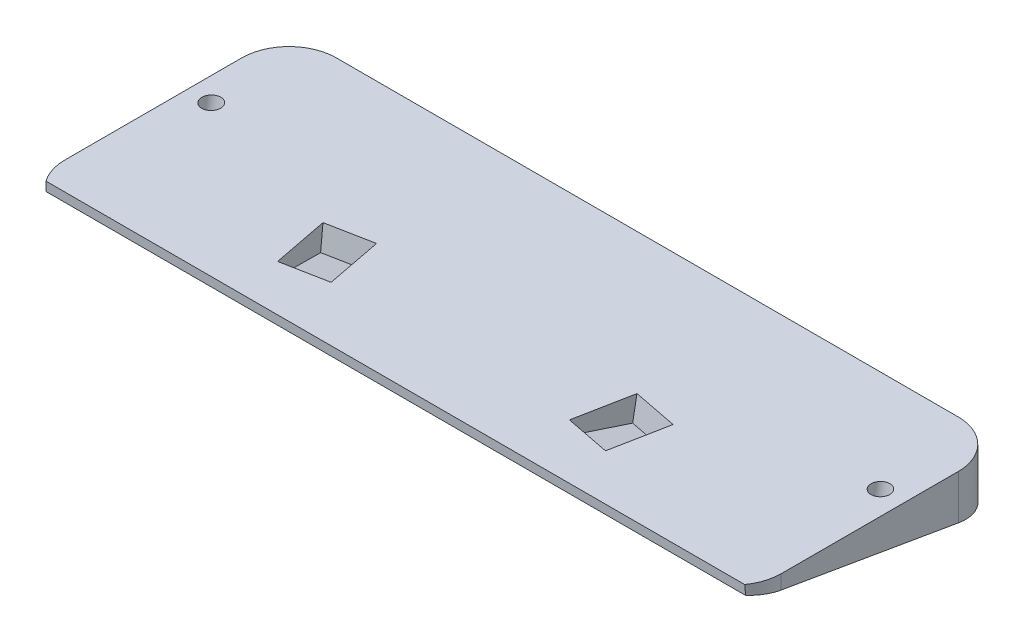
ISO-10303-21;
HEADER;
FILE_DESCRIPTION(('STEP AP214'),'2;1');
FILE_NAME('part.step','',(''),(''),'','','');
FILE_SCHEMA(('AUTOMOTIVE_DESIGN { 1 0 10303 214 1 1 1 1 }'));
ENDSEC;
DATA;
#1=APPLICATION_CONTEXT('core data for automotive mechanical design processes');
#2=APPLICATION_PROTOCOL_DEFINITION('international standard','automotive_design',2000,#1);
#3=PRODUCT_CONTEXT('',#1,'mechanical');
#4=PRODUCT('Part','Part','',(#3));
#5=PRODUCT_RELATED_PRODUCT_CATEGORY('part','',(#4));
#6=PRODUCT_DEFINITION_FORMATION('','',#4);
#7=PRODUCT_DEFINITION_CONTEXT('part definition',#1,'design');
#8=PRODUCT_DEFINITION('design','',#6,#7);
#9=PRODUCT_DEFINITION_SHAPE('','',#8);
#10=(LENGTH_UNIT() NAMED_UNIT(*) SI_UNIT(.MILLI.,.METRE.));
#11=(NAMED_UNIT(*) PLANE_ANGLE_UNIT() SI_UNIT($,.RADIAN.));
#12=(NAMED_UNIT(*) SI_UNIT($,.STERADIAN.) SOLID_ANGLE_UNIT());
#13=UNCERTAINTY_MEASURE_WITH_UNIT(LENGTH_MEASURE(1.E-05),#10,'distance_accuracy_value','');
#14=(GEOMETRIC_REPRESENTATION_CONTEXT(3) GLOBAL_UNCERTAINTY_ASSIGNED_CONTEXT((#13)) GLOBAL_UNIT_ASSIGNED_CONTEXT((#10,
#11,#12)) REPRESENTATION_CONTEXT('',''));
#15=CARTESIAN_POINT('',(0.,0.,0.));
#16=DIRECTION('',(0.,0.,1.));
#17=DIRECTION('',(1.,0.,0.));
#18=AXIS2_PLACEMENT_3D('',#15,#16,#17);
#19=CARTESIAN_POINT('',(91.,0.,0.));
#20=DIRECTION('',(1.,0.,0.));
#21=DIRECTION('',(0.,0.,-1.));
#22=AXIS2_PLACEMENT_3D('',#19,#20,#21);
#23=PLANE('',#22);
#24=DIRECTION('',(0.,-0.169243997267082,-0.985574182590565));
#25=VECTOR('',#24,1.);
#26=CARTESIAN_POINT('',(91.,-1.21159574928115,26.3770931054348));
#27=LINE('',#26,#25);
#28=CARTESIAN_POINT('',(90.999957548343,-1.80098821190085,22.9448296045039));
#29=VERTEX_POINT('',#28);
#30=CARTESIAN_POINT('',(91.,-2.45759332989941,19.1211604469208));
#31=VERTEX_POINT('',#30);
#32=EDGE_CURVE('E186',#29,#31,#27,.T.);
#33=ORIENTED_EDGE('',*,*,#32,.T.);
#34=CARTESIAN_POINT('',(91.,-2.45759332989941,19.1211604469208));
#35=DIRECTION('',(0.,-0.169243997267082,-0.985574182590565));
#36=VECTOR('',#35,1.);
#37=LINE('',#34,#36);
#38=CARTESIAN_POINT('',(91.,-5.66890595008374,0.420427411844289));
#39=VERTEX_POINT('',#38);
#40=EDGE_CURVE('E208',#31,#39,#37,.T.);
#41=ORIENTED_EDGE('',*,*,#40,.T.);
#42=DIRECTION('',(0.,0.99999085280807,0.00427718367499562));
#43=VECTOR('',#42,1.);
#44=CARTESIAN_POINT('',(91.,-0.0256631020499737,0.44456481881742));
#45=LINE('',#44,#43);
#46=CARTESIAN_POINT('',(91.,0.,0.444674585622615));
#47=VERTEX_POINT('',#46);
#48=EDGE_CURVE('E302',#39,#47,#45,.T.);
#49=ORIENTED_EDGE('',*,*,#48,.T.);
#50=CARTESIAN_POINT('',(91.,0.,0.444674585622615));
#51=DIRECTION('',(0.,0.,1.));
#52=VECTOR('',#51,1.);
#53=LINE('',#50,#52);
#54=CARTESIAN_POINT('',(91.,0.,19.1211604469208));
#55=VERTEX_POINT('',#54);
#56=EDGE_CURVE('E249',#47,#55,#53,.T.);
#57=ORIENTED_EDGE('',*,*,#56,.T.);
#58=DIRECTION('',(0.,0.,-1.));
#59=VECTOR('',#58,1.);
#60=CARTESIAN_POINT('',(91.,0.,0.));
#61=LINE('',#60,#59);
#62=CARTESIAN_POINT('',(90.9999569241782,0.,22.944830094197));
#63=VERTEX_POINT('',#62);
#64=EDGE_CURVE('E72',#55,#63,#61,.F.);
#65=ORIENTED_EDGE('',*,*,#64,.T.);
#66=CARTESIAN_POINT('',(91.,0.,22.9449728955236));
#67=DIRECTION('',(0.,-1.,0.));
#68=VECTOR('',#67,1.);
#69=LINE('',#66,#68);
#70=EDGE_CURVE('E467',#63,#29,#69,.T.);
#71=ORIENTED_EDGE('',*,*,#70,.T.);
#72=EDGE_LOOP('',(#33,#41,#49,#57,#65,#71));
#73=FACE_BOUND('',#72,.T.);
#74=ADVANCED_FACE('F49',(#73),#23,.T.);
#75=CARTESIAN_POINT('',(91.,0.,26.444619701969));
#76=DIRECTION('',(0.,-1.,0.));
#77=DIRECTION('',(0.,0.,-1.));
#78=AXIS2_PLACEMENT_3D('',#75,#76,#77);
#79=PLANE('',#78);
#80=CARTESIAN_POINT('',(88.,0.,7.32829853220453));
#81=DIRECTION('',(0.,-1.,0.));
#82=DIRECTION('',(0.,0.,1.));
#83=AXIS2_PLACEMENT_3D('',#80,#81,#82);
#84=ELLIPSE('',#83,1.20354779290873,1.1861856322047);
#85=CARTESIAN_POINT('',(88.,0.,8.53184632511326));
#86=VERTEX_POINT('',#85);
#87=EDGE_CURVE('E320',#86,#86,#84,.F.);
#88=ORIENTED_EDGE('',*,*,#87,.F.);
#89=EDGE_LOOP('',(#88));
#90=FACE_BOUND('',#89,.T.);
#91=CARTESIAN_POINT('',(3.,0.,7.32829853220453));
#92=DIRECTION('',(0.,-1.,0.));
#93=DIRECTION('',(0.,0.,1.));
#94=AXIS2_PLACEMENT_3D('',#91,#92,#93);
#95=ELLIPSE('',#94,1.2175643611583,1.2);
#96=CARTESIAN_POINT('',(3.,0.,8.54586289336284));
#97=VERTEX_POINT('',#96);
#98=EDGE_CURVE('E178',#97,#97,#95,.F.);
#99=ORIENTED_EDGE('',*,*,#98,.F.);
#100=EDGE_LOOP('',(#99));
#101=FACE_BOUND('',#100,.T.);
#102=DIRECTION('',(0.190808995376538,0.,0.981627183447665));
#103=VECTOR('',#102,1.);
#104=CARTESIAN_POINT('',(28.9751762499517,0.,12.3091260239187));
#105=LINE('',#104,#103);
#106=CARTESIAN_POINT('',(28.9751762499517,0.,12.3091260239187));
#107=VERTEX_POINT('',#106);
#108=CARTESIAN_POINT('',(30.3661738262467,0.,19.4651881912522));
#109=VERTEX_POINT('',#108);
#110=EDGE_CURVE('E390',#107,#109,#105,.T.);
#111=ORIENTED_EDGE('',*,*,#110,.T.);
#112=DIRECTION('',(-0.981627183447665,0.,0.190808995376538));
#113=VECTOR('',#112,1.);
#114=CARTESIAN_POINT('',(30.3661738262467,0.,19.4651881912522));
#115=LINE('',#114,#113);
#116=CARTESIAN_POINT('',(24.6727361622502,0.,20.5718803644361));
#117=VERTEX_POINT('',#116);
#118=EDGE_CURVE('E406',#109,#117,#115,.T.);
#119=ORIENTED_EDGE('',*,*,#118,.T.);
#120=DIRECTION('',(0.190808995376538,0.,0.981627183447665));
#121=VECTOR('',#120,1.);
#122=CARTESIAN_POINT('',(23.2817385859553,0.,13.4158181971026));
#123=LINE('',#122,#121);
#124=CARTESIAN_POINT('',(23.2817385859553,0.,13.4158181971026));
#125=VERTEX_POINT('',#124);
#126=EDGE_CURVE('E374',#125,#117,#123,.T.);
#127=ORIENTED_EDGE('',*,*,#126,.F.);
#128=DIRECTION('',(-0.981627183447665,0.,0.190808995376538));
#129=VECTOR('',#128,1.);
#130=CARTESIAN_POINT('',(28.9751762499517,0.,12.3091260239187));
#131=LINE('',#130,#129);
#132=EDGE_CURVE('E410',#107,#125,#131,.T.);
#133=ORIENTED_EDGE('',*,*,#132,.F.);
#134=EDGE_LOOP('',(#111,#119,#127,#133));
#135=FACE_BOUND('',#134,.T.);
#136=DIRECTION('',(0.190808995376539,0.,-0.981627183447665));
#137=VECTOR('',#136,1.);
#138=CARTESIAN_POINT('',(62.0302970027858,0.,12.2809685795672));
#139=LINE('',#138,#137);
#140=CARTESIAN_POINT('',(60.6333946725982,0.,19.4674080722528));
#141=VERTEX_POINT('',#140);
#142=CARTESIAN_POINT('',(62.0302970027858,0.,12.2809685795672));
#143=VERTEX_POINT('',#142);
#144=EDGE_CURVE('E344',#141,#143,#139,.T.);
#145=ORIENTED_EDGE('',*,*,#144,.T.);
#146=DIRECTION('',(0.981627183447665,0.,0.190808995376538));
#147=VECTOR('',#146,1.);
#148=CARTESIAN_POINT('',(62.0302970027858,0.,12.2809685795672));
#149=LINE('',#148,#147);
#150=CARTESIAN_POINT('',(67.7237346667823,0.,13.3876607527512));
#151=VERTEX_POINT('',#150);
#152=EDGE_CURVE('E367',#143,#151,#149,.T.);
#153=ORIENTED_EDGE('',*,*,#152,.T.);
#154=DIRECTION('',(0.190808995376539,0.,-0.981627183447665));
#155=VECTOR('',#154,1.);
#156=CARTESIAN_POINT('',(67.7237346667823,0.,13.3876607527512));
#157=LINE('',#156,#155);
#158=CARTESIAN_POINT('',(66.3268323365946,0.,20.5741002454367));
#159=VERTEX_POINT('',#158);
#160=EDGE_CURVE('E322',#159,#151,#157,.T.);
#161=ORIENTED_EDGE('',*,*,#160,.F.);
#162=DIRECTION('',(0.981627183447665,0.,0.190808995376538));
#163=VECTOR('',#162,1.);
#164=CARTESIAN_POINT('',(60.6333946725982,0.,19.4674080722528));
#165=LINE('',#164,#163);
#166=EDGE_CURVE('E357',#141,#159,#165,.T.);
#167=ORIENTED_EDGE('',*,*,#166,.F.);
#168=EDGE_LOOP('',(#145,#153,#161,#167));
#169=FACE_BOUND('',#168,.T.);
#170=CARTESIAN_POINT('',(6.,0.,22.944619701969));
#171=DIRECTION('',(0.,-1.,0.));
#172=DIRECTION('',(0.,0.,-1.));
#173=AXIS2_PLACEMENT_3D('',#170,#171,#172);
#174=CIRCLE('',#173,6.);
#175=CARTESIAN_POINT('',(1.12660282759557,0.,26.444619701969));
#176=VERTEX_POINT('',#175);
#177=CARTESIAN_POINT('',(0.,0.,22.944619701969));
#178=VERTEX_POINT('',#177);
#179=EDGE_CURVE('E179',#176,#178,#174,.T.);
#180=ORIENTED_EDGE('',*,*,#179,.F.);
#181=DIRECTION('',(-1.,0.,0.));
#182=VECTOR('',#181,1.);
#183=CARTESIAN_POINT('',(91.,0.,26.444619701969));
#184=LINE('',#183,#182);
#185=CARTESIAN_POINT('',(89.8731720918144,0.,26.444619701969));
#186=VERTEX_POINT('',#185);
#187=EDGE_CURVE('E201',#186,#176,#184,.T.);
#188=ORIENTED_EDGE('',*,*,#187,.F.);
#189=CARTESIAN_POINT('',(84.9997749194099,0.,22.944619701969));
#190=DIRECTION('',(0.,-1.,0.));
#191=DIRECTION('',(0.,0.,-1.));
#192=AXIS2_PLACEMENT_3D('',#189,#190,#191);
#193=CIRCLE('',#192,6.00000000000001);
#194=EDGE_CURVE('E68',#63,#186,#193,.T.);
#195=ORIENTED_EDGE('',*,*,#194,.F.);
#196=ORIENTED_EDGE('',*,*,#64,.F.);
#197=ORIENTED_EDGE('',*,*,#56,.F.);
#198=CARTESIAN_POINT('',(85.,0.,0.444674585622616));
#199=DIRECTION('',(0.,-1.,0.));
#200=DIRECTION('',(0.,0.,-1.));
#201=AXIS2_PLACEMENT_3D('',#198,#199,#200);
#202=ELLIPSE('',#201,6.00005488365361,6.);
#203=CARTESIAN_POINT('',(85.,0.,-5.555380298031));
#204=VERTEX_POINT('',#203);
#205=EDGE_CURVE('E253',#47,#204,#202,.F.);
#206=ORIENTED_EDGE('',*,*,#205,.T.);
#207=DIRECTION('',(-1.,0.,0.));
#208=VECTOR('',#207,1.);
#209=CARTESIAN_POINT('',(91.,0.,-5.555380298031));
#210=LINE('',#209,#208);
#211=CARTESIAN_POINT('',(6.00000000000001,0.,-5.555380298031));
#212=VERTEX_POINT('',#211);
#213=EDGE_CURVE('E420',#204,#212,#210,.T.);
#214=ORIENTED_EDGE('',*,*,#213,.T.);
#215=CARTESIAN_POINT('',(6.00000000000001,0.,0.444674585622616));
#216=DIRECTION('',(0.,-1.,0.));
#217=DIRECTION('',(0.,0.,1.));
#218=AXIS2_PLACEMENT_3D('',#215,#216,#217);
#219=ELLIPSE('',#218,6.00005488365361,6.);
#220=CARTESIAN_POINT('',(0.,0.,0.444674585622615));
#221=VERTEX_POINT('',#220);
#222=EDGE_CURVE('E435',#212,#221,#219,.F.);
#223=ORIENTED_EDGE('',*,*,#222,.T.);
#224=DIRECTION('',(0.,0.,1.));
#225=VECTOR('',#224,1.);
#226=CARTESIAN_POINT('',(0.,0.,26.444619701969));
#227=LINE('',#226,#225);
#228=EDGE_CURVE('E417',#221,#178,#227,.T.);
#229=ORIENTED_EDGE('',*,*,#228,.T.);
#230=EDGE_LOOP('',(#180,#188,#195,#196,#197,#206,#214,#223,#229));
#231=FACE_BOUND('',#230,.T.);
#232=ADVANCED_FACE('F229',(#90,#101,#135,#169,#231),#79,.F.);
#233=CARTESIAN_POINT('',(91.,-1.2,26.444619701969));
#234=DIRECTION('',(0.,0.985574182590565,-0.169243997267082));
#235=DIRECTION('',(0.,0.169243997267082,0.985574182590565));
#236=AXIS2_PLACEMENT_3D('',#233,#234,#235);
#237=PLANE('',#236);
#238=CARTESIAN_POINT('',(3.,-4.35427819787824,8.07602047991708));
#239=DIRECTION('',(0.,0.985574182590565,-0.169243997267082));
#240=DIRECTION('',(0.,0.169243997267082,0.985574182590565));
#241=AXIS2_PLACEMENT_3D('',#238,#239,#240);
#242=CIRCLE('',#241,2.40000000000001);
#243=CARTESIAN_POINT('',(3.,-4.76046379131924,5.71064244169972));
#244=VERTEX_POINT('',#243);
#245=EDGE_CURVE('E198',#244,#244,#242,.T.);
#246=ORIENTED_EDGE('',*,*,#245,.T.);
#247=EDGE_LOOP('',(#246));
#248=FACE_BOUND('',#247,.T.);
#249=CARTESIAN_POINT('',(88.,-4.35427819787824,8.07602047991709));
#250=DIRECTION('',(0.,0.985574182590565,-0.169243997267082));
#251=DIRECTION('',(0.,0.169243997267082,0.985574182590565));
#252=AXIS2_PLACEMENT_3D('',#249,#250,#251);
#253=CIRCLE('',#252,2.3861856322047);
#254=CARTESIAN_POINT('',(88.,-4.75812579249384,5.72425752594759));
#255=VERTEX_POINT('',#254);
#256=EDGE_CURVE('E301',#255,#255,#253,.T.);
#257=ORIENTED_EDGE('',*,*,#256,.T.);
#258=EDGE_LOOP('',(#257));
#259=FACE_BOUND('',#258,.T.);
#260=CARTESIAN_POINT('',(6.,-1.80102425661943,22.944619701969));
#261=DIRECTION('',(0.,0.985574182590565,-0.169243997267082));
#262=DIRECTION('',(0.,-0.169243997267082,-0.985574182590565));
#263=AXIS2_PLACEMENT_3D('',#260,#261,#262);
#264=ELLIPSE('',#263,6.08782180579153,6.);
#265=CARTESIAN_POINT('',(0.,-1.80102425661942,22.944619701969));
#266=VERTEX_POINT('',#265);
#267=CARTESIAN_POINT('',(1.07880844362869,-1.21159574928115,26.3770931054348));
#268=VERTEX_POINT('',#267);
#269=EDGE_CURVE('E471',#266,#268,#264,.T.);
#270=ORIENTED_EDGE('',*,*,#269,.F.);
#271=DIRECTION('',(0.,-0.169243997267082,-0.985574182590565));
#272=VECTOR('',#271,1.);
#273=CARTESIAN_POINT('',(0.,-1.2,26.444619701969));
#274=LINE('',#273,#272);
#275=CARTESIAN_POINT('',(0.,-5.66890595008374,0.420427411844289));
#276=VERTEX_POINT('',#275);
#277=EDGE_CURVE('E414',#266,#276,#274,.T.);
#278=ORIENTED_EDGE('',*,*,#277,.T.);
#279=CARTESIAN_POINT('',(6.00000000000001,-5.66890595008374,0.42042741184428));
#280=DIRECTION('',(0.,0.985574182590565,-0.169243997267082));
#281=DIRECTION('',(0.,0.169243997267082,0.985574182590565));
#282=AXIS2_PLACEMENT_3D('',#279,#280,#281);
#283=ELLIPSE('',#282,6.09235226398665,6.);
#284=CARTESIAN_POINT('',(6.00000000000001,-6.7,-5.58403769078814));
#285=VERTEX_POINT('',#284);
#286=EDGE_CURVE('E308',#276,#285,#283,.F.);
#287=ORIENTED_EDGE('',*,*,#286,.T.);
#288=DIRECTION('',(-1.,0.,0.));
#289=VECTOR('',#288,1.);
#290=CARTESIAN_POINT('',(91.,-6.7,-5.58403769078814));
#291=LINE('',#290,#289);
#292=CARTESIAN_POINT('',(85.,-6.7,-5.58403769078814));
#293=VERTEX_POINT('',#292);
#294=EDGE_CURVE('E424',#293,#285,#291,.T.);
#295=ORIENTED_EDGE('',*,*,#294,.F.);
#296=CARTESIAN_POINT('',(85.,-5.66890595008374,0.42042741184428));
#297=DIRECTION('',(0.,0.985574182590565,-0.169243997267082));
#298=DIRECTION('',(0.,-0.169243997267082,-0.985574182590565));
#299=AXIS2_PLACEMENT_3D('',#296,#297,#298);
#300=ELLIPSE('',#299,6.09235226398665,6.);
#301=EDGE_CURVE('E440',#293,#39,#300,.F.);
#302=ORIENTED_EDGE('',*,*,#301,.T.);
#303=ORIENTED_EDGE('',*,*,#40,.F.);
#304=ORIENTED_EDGE('',*,*,#32,.F.);
#305=CARTESIAN_POINT('',(84.9997749194099,-1.80102425661943,22.944619701969));
#306=DIRECTION('',(0.,0.985574182590565,-0.169243997267082));
#307=DIRECTION('',(0.,-0.169243997267082,-0.985574182590565));
#308=AXIS2_PLACEMENT_3D('',#305,#306,#307);
#309=ELLIPSE('',#308,6.08782180579154,6.00000000000001);
#310=CARTESIAN_POINT('',(89.9209664757812,-1.21159574928115,26.3770931054348));
#311=VERTEX_POINT('',#310);
#312=EDGE_CURVE('E183',#311,#29,#309,.T.);
#313=ORIENTED_EDGE('',*,*,#312,.F.);
#314=DIRECTION('',(1.,0.,0.));
#315=VECTOR('',#314,1.);
#316=CARTESIAN_POINT('',(-1.21347604051983,-1.21159574928115,26.3770931054348));
#317=LINE('',#316,#315);
#318=EDGE_CURVE('E171',#268,#311,#317,.T.);
#319=ORIENTED_EDGE('',*,*,#318,.F.);
#320=EDGE_LOOP('',(#270,#278,#287,#295,#302,#303,#304,#313,#319));
#321=FACE_BOUND('',#320,.T.);
#322=ADVANCED_FACE('F184',(#248,#259,#321),#237,.F.);
#323=CARTESIAN_POINT('',(0.,0.,0.));
#324=DIRECTION('',(1.,0.,0.));
#325=DIRECTION('',(0.,0.,-1.));
#326=AXIS2_PLACEMENT_3D('',#323,#324,#325);
#327=PLANE('',#326);
#328=DIRECTION('',(0.,0.99999085280807,0.00427718367499562));
#329=VECTOR('',#328,1.);
#330=CARTESIAN_POINT('',(0.,-0.00190193748076418,0.44466645061226));
#331=LINE('',#330,#329);
#332=EDGE_CURVE('E437',#221,#276,#331,.F.);
#333=ORIENTED_EDGE('',*,*,#332,.T.);
#334=ORIENTED_EDGE('',*,*,#277,.F.);
#335=DIRECTION('',(0.,-1.,0.));
#336=VECTOR('',#335,1.);
#337=CARTESIAN_POINT('',(0.,120.880396042836,22.944619701969));
#338=LINE('',#337,#336);
#339=EDGE_CURVE('E190',#178,#266,#338,.T.);
#340=ORIENTED_EDGE('',*,*,#339,.F.);
#341=ORIENTED_EDGE('',*,*,#228,.F.);
#342=EDGE_LOOP('',(#333,#334,#340,#341));
#343=FACE_BOUND('',#342,.T.);
#344=ADVANCED_FACE('F232',(#343),#327,.F.);
#345=CARTESIAN_POINT('',(-1.21347604051983,0.,26.444619701969));
#346=DIRECTION('',(0.,0.055647243356631,-0.998450491665364));
#347=DIRECTION('',(0.,0.998450491665365,0.055647243356631));
#348=AXIS2_PLACEMENT_3D('',#345,#346,#347);
#349=PLANE('',#348);
#350=CARTESIAN_POINT('',(6.,-62.7987391654389,22.944619701969));
#351=DIRECTION('',(0.,0.055647243356631,-0.998450491665364));
#352=DIRECTION('',(0.,-0.998450491665365,-0.055647243356631));
#353=AXIS2_PLACEMENT_3D('',#350,#351,#352);
#354=ELLIPSE('',#353,107.822052595621,6.);
#355=EDGE_CURVE('E11',#268,#176,#354,.T.);
#356=ORIENTED_EDGE('',*,*,#355,.F.);
#357=ORIENTED_EDGE('',*,*,#318,.T.);
#358=CARTESIAN_POINT('',(84.9997749194099,-62.7987391654389,22.944619701969));
#359=DIRECTION('',(0.,0.055647243356631,-0.998450491665364));
#360=DIRECTION('',(0.,-0.998450491665365,-0.055647243356631));
#361=AXIS2_PLACEMENT_3D('',#358,#359,#360);
#362=ELLIPSE('',#361,107.822052595621,6.00000000000001);
#363=EDGE_CURVE('E60',#186,#311,#362,.T.);
#364=ORIENTED_EDGE('',*,*,#363,.F.);
#365=ORIENTED_EDGE('',*,*,#187,.T.);
#366=EDGE_LOOP('',(#356,#357,#364,#365));
#367=FACE_BOUND('',#366,.T.);
#368=ADVANCED_FACE('F173',(#367),#349,.F.);
#369=CARTESIAN_POINT('',(91.,0.,-5.555380298031));
#370=DIRECTION('',(0.,-0.00427718367499562,0.99999085280807));
#371=DIRECTION('',(0.,-0.99999085280807,-0.00427718367499562));
#372=AXIS2_PLACEMENT_3D('',#369,#370,#371);
#373=PLANE('',#372);
#374=ORIENTED_EDGE('',*,*,#294,.T.);
#375=DIRECTION('',(0.,0.99999085280807,0.00427718367499562));
#376=VECTOR('',#375,1.);
#377=CARTESIAN_POINT('',(6.00000000000001,0.,-5.555380298031));
#378=LINE('',#377,#376);
#379=EDGE_CURVE('E431',#285,#212,#378,.T.);
#380=ORIENTED_EDGE('',*,*,#379,.T.);
#381=ORIENTED_EDGE('',*,*,#213,.F.);
#382=DIRECTION('',(0.,0.99999085280807,0.00427718367499562));
#383=VECTOR('',#382,1.);
#384=CARTESIAN_POINT('',(85.,-6.7,-5.58403769078814));
#385=LINE('',#384,#383);
#386=EDGE_CURVE('E428',#204,#293,#385,.F.);
#387=ORIENTED_EDGE('',*,*,#386,.T.);
#388=EDGE_LOOP('',(#374,#380,#381,#387));
#389=FACE_BOUND('',#388,.T.);
#390=ADVANCED_FACE('F264',(#389),#373,.F.);
#391=CARTESIAN_POINT('',(6.00000000000001,-0.0256631020499737,0.44456481881742));
#392=DIRECTION('',(0.,0.99999085280807,0.00427718367499562));
#393=DIRECTION('',(0.,-0.00427718367499562,0.99999085280807));
#394=AXIS2_PLACEMENT_3D('',#391,#392,#393);
#395=CYLINDRICAL_SURFACE('',#394,6.);
#396=ORIENTED_EDGE('',*,*,#286,.F.);
#397=ORIENTED_EDGE('',*,*,#332,.F.);
#398=ORIENTED_EDGE('',*,*,#222,.F.);
#399=ORIENTED_EDGE('',*,*,#379,.F.);
#400=EDGE_LOOP('',(#396,#397,#398,#399));
#401=FACE_BOUND('',#400,.T.);
#402=ADVANCED_FACE('F266',(#401),#395,.T.);
#403=CARTESIAN_POINT('',(85.,-0.00190193748076418,0.44466645061226));
#404=DIRECTION('',(0.,-0.99999085280807,-0.00427718367499562));
#405=DIRECTION('',(0.,0.00427718367499562,-0.99999085280807));
#406=AXIS2_PLACEMENT_3D('',#403,#404,#405);
#407=CYLINDRICAL_SURFACE('',#406,6.);
#408=ORIENTED_EDGE('',*,*,#301,.F.);
#409=ORIENTED_EDGE('',*,*,#386,.F.);
#410=ORIENTED_EDGE('',*,*,#205,.F.);
#411=ORIENTED_EDGE('',*,*,#48,.F.);
#412=EDGE_LOOP('',(#408,#409,#410,#411));
#413=FACE_BOUND('',#412,.T.);
#414=ADVANCED_FACE('F274',(#413),#407,.T.);
#415=CARTESIAN_POINT('',(28.9751762499517,0.,12.3091260239187));
#416=DIRECTION('',(0.189338599690391,0.123906585331739,0.974062653415431));
#417=DIRECTION('',(0.981627183447665,0.,-0.190808995376538));
#418=AXIS2_PLACEMENT_3D('',#415,#416,#417);
#419=PLANE('',#418);
#420=DIRECTION('',(-0.981627183447665,0.,0.190808995376538));
#421=VECTOR('',#420,1.);
#422=CARTESIAN_POINT('',(29.0484679722616,-3.07611104959669,12.6861792482651));
#423=LINE('',#422,#421);
#424=CARTESIAN_POINT('',(29.0484679722616,-3.07611104959669,12.6861792482651));
#425=VERTEX_POINT('',#424);
#426=CARTESIAN_POINT('',(23.3550303082651,-3.07611104959669,13.792871421449));
#427=VERTEX_POINT('',#426);
#428=EDGE_CURVE('E400',#425,#427,#423,.T.);
#429=ORIENTED_EDGE('',*,*,#428,.F.);
#430=DIRECTION('',(-0.0236424910676859,0.992293886966673,-0.121630072369813));
#431=VECTOR('',#430,1.);
#432=CARTESIAN_POINT('',(28.9751762499517,0.,12.3091260239187));
#433=LINE('',#432,#431);
#434=EDGE_CURVE('E386',#425,#107,#433,.T.);
#435=ORIENTED_EDGE('',*,*,#434,.T.);
#436=ORIENTED_EDGE('',*,*,#132,.T.);
#437=DIRECTION('',(-0.0236424910676859,0.992293886966673,-0.121630072369813));
#438=VECTOR('',#437,1.);
#439=CARTESIAN_POINT('',(23.2817385859553,0.,13.4158181971026));
#440=LINE('',#439,#438);
#441=EDGE_CURVE('E371',#427,#125,#440,.T.);
#442=ORIENTED_EDGE('',*,*,#441,.F.);
#443=EDGE_LOOP('',(#429,#435,#436,#442));
#444=FACE_BOUND('',#443,.T.);
#445=ADVANCED_FACE('F230',(#444),#419,.T.);
#446=CARTESIAN_POINT('',(30.3661738262467,0.,19.4651881912522));
#447=DIRECTION('',(-0.190156009094342,-0.0826600617749903,-0.978267860247216));
#448=DIRECTION('',(-0.981627183447665,0.,0.190808995376538));
#449=AXIS2_PLACEMENT_3D('',#446,#447,#448);
#450=PLANE('',#449);
#451=ORIENTED_EDGE('',*,*,#118,.F.);
#452=DIRECTION('',(0.0157722833450485,-0.996577801371952,0.0811413636237937));
#453=VECTOR('',#452,1.);
#454=CARTESIAN_POINT('',(30.3661738262467,0.,19.4651881912522));
#455=LINE('',#454,#453);
#456=CARTESIAN_POINT('',(30.3930787820361,-1.7,19.6036021896079));
#457=VERTEX_POINT('',#456);
#458=EDGE_CURVE('E394',#109,#457,#455,.T.);
#459=ORIENTED_EDGE('',*,*,#458,.T.);
#460=DIRECTION('',(-0.981627183447665,0.,0.190808995376538));
#461=VECTOR('',#460,1.);
#462=CARTESIAN_POINT('',(30.3930787820361,-1.7,19.6036021896079));
#463=LINE('',#462,#461);
#464=CARTESIAN_POINT('',(24.6996411180396,-1.7,20.7102943627918));
#465=VERTEX_POINT('',#464);
#466=EDGE_CURVE('E403',#457,#465,#463,.T.);
#467=ORIENTED_EDGE('',*,*,#466,.T.);
#468=DIRECTION('',(0.0157722833450485,-0.996577801371952,0.0811413636237937));
#469=VECTOR('',#468,1.);
#470=CARTESIAN_POINT('',(24.6727361622502,0.,20.5718803644361));
#471=LINE('',#470,#469);
#472=EDGE_CURVE('E378',#117,#465,#471,.T.);
#473=ORIENTED_EDGE('',*,*,#472,.F.);
#474=EDGE_LOOP('',(#451,#459,#467,#473));
#475=FACE_BOUND('',#474,.T.);
#476=ADVANCED_FACE('F528',(#475),#450,.T.);
#477=CARTESIAN_POINT('',(29.0484679722616,-3.07611104959669,12.6861792482651));
#478=DIRECTION('',(-0.0365702460863646,0.981461592815054,-0.188137606368636));
#479=DIRECTION('',(0.,0.18826353870623,0.982118546812862));
#480=AXIS2_PLACEMENT_3D('',#477,#478,#479);
#481=PLANE('',#480);
#482=ORIENTED_EDGE('',*,*,#466,.F.);
#483=DIRECTION('',(-0.187271700525698,-0.191658920556641,-0.963429379017101));
#484=VECTOR('',#483,1.);
#485=CARTESIAN_POINT('',(29.0484679722616,-3.07611104959669,12.6861792482651));
#486=LINE('',#485,#484);
#487=EDGE_CURVE('E397',#457,#425,#486,.T.);
#488=ORIENTED_EDGE('',*,*,#487,.T.);
#489=ORIENTED_EDGE('',*,*,#428,.T.);
#490=DIRECTION('',(-0.187271700525698,-0.191658920556641,-0.963429379017101));
#491=VECTOR('',#490,1.);
#492=CARTESIAN_POINT('',(23.3550303082651,-3.07611104959669,13.792871421449));
#493=LINE('',#492,#491);
#494=EDGE_CURVE('E382',#465,#427,#493,.T.);
#495=ORIENTED_EDGE('',*,*,#494,.F.);
#496=EDGE_LOOP('',(#482,#488,#489,#495));
#497=FACE_BOUND('',#496,.T.);
#498=ADVANCED_FACE('F525',(#497),#481,.T.);
#499=CARTESIAN_POINT('',(25.6147060421935,0.,-4.97899447895319));
#500=DIRECTION('',(-0.981627183447665,0.,0.190808995376539));
#501=DIRECTION('',(0.190808995376539,0.,0.981627183447665));
#502=AXIS2_PLACEMENT_3D('',#499,#500,#501);
#503=PLANE('',#502);
#504=ORIENTED_EDGE('',*,*,#434,.F.);
#505=ORIENTED_EDGE('',*,*,#487,.F.);
#506=ORIENTED_EDGE('',*,*,#458,.F.);
#507=ORIENTED_EDGE('',*,*,#110,.F.);
#508=EDGE_LOOP('',(#504,#505,#506,#507));
#509=FACE_BOUND('',#508,.T.);
#510=ADVANCED_FACE('F521',(#509),#503,.T.);
#511=CARTESIAN_POINT('',(19.921268378197,0.,-3.87230230576926));
#512=DIRECTION('',(-0.981627183447665,0.,0.190808995376539));
#513=DIRECTION('',(0.190808995376539,0.,0.981627183447665));
#514=AXIS2_PLACEMENT_3D('',#511,#512,#513);
#515=PLANE('',#514);
#516=ORIENTED_EDGE('',*,*,#441,.T.);
#517=ORIENTED_EDGE('',*,*,#126,.T.);
#518=ORIENTED_EDGE('',*,*,#472,.T.);
#519=ORIENTED_EDGE('',*,*,#494,.T.);
#520=EDGE_LOOP('',(#516,#517,#518,#519));
#521=FACE_BOUND('',#520,.T.);
#522=ADVANCED_FACE('F517',(#521),#515,.F.);
#523=CARTESIAN_POINT('',(62.0302970027858,0.,12.2809685795672));
#524=DIRECTION('',(-0.188567956597884,0.152813355564624,0.970098038398995));
#525=DIRECTION('',(0.981627183447665,0.,0.190808995376538));
#526=AXIS2_PLACEMENT_3D('',#523,#524,#525);
#527=PLANE('',#526);
#528=ORIENTED_EDGE('',*,*,#152,.F.);
#529=DIRECTION('',(-0.0291581628554035,-0.98825506746036,0.150005743816089));
#530=VECTOR('',#529,1.);
#531=CARTESIAN_POINT('',(62.0302970027858,0.,12.2809685795672));
#532=LINE('',#531,#530);
#533=CARTESIAN_POINT('',(61.9399066979341,-3.06359070912711,12.7459863853971));
#534=VERTEX_POINT('',#533);
#535=EDGE_CURVE('E348',#143,#534,#532,.T.);
#536=ORIENTED_EDGE('',*,*,#535,.T.);
#537=DIRECTION('',(0.981627183447665,0.,0.190808995376538));
#538=VECTOR('',#537,1.);
#539=CARTESIAN_POINT('',(61.9399066979341,-3.06359070912711,12.7459863853971));
#540=LINE('',#539,#538);
#541=CARTESIAN_POINT('',(67.6333443619306,-3.06359070912711,13.852678558581));
#542=VERTEX_POINT('',#541);
#543=EDGE_CURVE('E364',#534,#542,#540,.T.);
#544=ORIENTED_EDGE('',*,*,#543,.T.);
#545=DIRECTION('',(-0.0291581628554035,-0.98825506746036,0.150005743816089));
#546=VECTOR('',#545,1.);
#547=CARTESIAN_POINT('',(67.7237346667823,0.,13.3876607527512));
#548=LINE('',#547,#546);
#549=EDGE_CURVE('E327',#151,#542,#548,.T.);
#550=ORIENTED_EDGE('',*,*,#549,.F.);
#551=EDGE_LOOP('',(#528,#536,#544,#550));
#552=FACE_BOUND('',#551,.T.);
#553=ADVANCED_FACE('F513',(#552),#527,.T.);
#554=CARTESIAN_POINT('',(60.5952684449604,-1.68821637682337,19.6635505097605));
#555=DIRECTION('',(0.0365506677734757,0.981481624221763,-0.188036884680437));
#556=DIRECTION('',(0.,0.188162614733043,0.982137887680149));
#557=AXIS2_PLACEMENT_3D('',#554,#555,#556);
#558=PLANE('',#557);
#559=ORIENTED_EDGE('',*,*,#543,.F.);
#560=DIRECTION('',(-0.187275522698288,0.19155631369133,0.963449042390448));
#561=VECTOR('',#560,1.);
#562=CARTESIAN_POINT('',(60.5952684449604,-1.68821637682337,19.6635505097605));
#563=LINE('',#562,#561);
#564=CARTESIAN_POINT('',(60.5952684449604,-1.68821637682337,19.6635505097605));
#565=VERTEX_POINT('',#564);
#566=EDGE_CURVE('E351',#534,#565,#563,.T.);
#567=ORIENTED_EDGE('',*,*,#566,.T.);
#568=DIRECTION('',(0.981627183447665,0.,0.190808995376538));
#569=VECTOR('',#568,1.);
#570=CARTESIAN_POINT('',(60.5952684449604,-1.68821637682337,19.6635505097605));
#571=LINE('',#570,#569);
#572=CARTESIAN_POINT('',(66.2887061089568,-1.68821637682337,20.7702426829445));
#573=VERTEX_POINT('',#572);
#574=EDGE_CURVE('E361',#565,#573,#571,.T.);
#575=ORIENTED_EDGE('',*,*,#574,.T.);
#576=DIRECTION('',(-0.187275522698288,0.19155631369133,0.963449042390448));
#577=VECTOR('',#576,1.);
#578=CARTESIAN_POINT('',(66.2887061089568,-1.68821637682337,20.7702426829445));
#579=LINE('',#578,#577);
#580=EDGE_CURVE('E337',#542,#573,#579,.T.);
#581=ORIENTED_EDGE('',*,*,#580,.F.);
#582=EDGE_LOOP('',(#559,#567,#575,#581));
#583=FACE_BOUND('',#582,.T.);
#584=ADVANCED_FACE('F509',(#583),#558,.T.);
#585=CARTESIAN_POINT('',(60.6333946725982,0.,19.4674080722528));
#586=DIRECTION('',(0.189486394611699,-0.117537397457834,-0.974822992371384));
#587=DIRECTION('',(-0.981627183447665,0.,-0.190808995376539));
#588=AXIS2_PLACEMENT_3D('',#585,#586,#587);
#589=PLANE('',#588);
#590=ORIENTED_EDGE('',*,*,#574,.F.);
#591=DIRECTION('',(0.0224271927280996,0.993068456954927,-0.115377904416303));
#592=VECTOR('',#591,1.);
#593=CARTESIAN_POINT('',(60.6333946725982,0.,19.4674080722528));
#594=LINE('',#593,#592);
#595=EDGE_CURVE('E354',#565,#141,#594,.T.);
#596=ORIENTED_EDGE('',*,*,#595,.T.);
#597=ORIENTED_EDGE('',*,*,#166,.T.);
#598=DIRECTION('',(0.0224271927280996,0.993068456954927,-0.115377904416303));
#599=VECTOR('',#598,1.);
#600=CARTESIAN_POINT('',(66.3268323365946,0.,20.5741002454367));
#601=LINE('',#600,#599);
#602=EDGE_CURVE('E341',#573,#159,#601,.T.);
#603=ORIENTED_EDGE('',*,*,#602,.F.);
#604=EDGE_LOOP('',(#590,#596,#597,#603));
#605=FACE_BOUND('',#604,.T.);
#606=ADVANCED_FACE('F505',(#605),#589,.T.);
#607=CARTESIAN_POINT('',(62.0721593405956,1.7975670176372E-13,12.0656055214703));
#608=DIRECTION('',(0.981627183447665,0.,0.190808995376539));
#609=DIRECTION('',(0.190808995376539,0.,-0.981627183447665));
#610=AXIS2_PLACEMENT_3D('',#607,#608,#609);
#611=PLANE('',#610);
#612=ORIENTED_EDGE('',*,*,#144,.F.);
#613=ORIENTED_EDGE('',*,*,#595,.F.);
#614=ORIENTED_EDGE('',*,*,#566,.F.);
#615=ORIENTED_EDGE('',*,*,#535,.F.);
#616=EDGE_LOOP('',(#612,#613,#614,#615));
#617=FACE_BOUND('',#616,.T.);
#618=ADVANCED_FACE('F501',(#617),#611,.T.);
#619=CARTESIAN_POINT('',(67.765597004592,1.7975670176372E-13,13.1722976946542));
#620=DIRECTION('',(0.981627183447665,0.,0.190808995376539));
#621=DIRECTION('',(0.190808995376539,0.,-0.981627183447665));
#622=AXIS2_PLACEMENT_3D('',#619,#620,#621);
#623=PLANE('',#622);
#624=ORIENTED_EDGE('',*,*,#160,.T.);
#625=ORIENTED_EDGE('',*,*,#549,.T.);
#626=ORIENTED_EDGE('',*,*,#580,.T.);
#627=ORIENTED_EDGE('',*,*,#602,.T.);
#628=EDGE_LOOP('',(#624,#625,#626,#627));
#629=FACE_BOUND('',#628,.T.);
#630=ADVANCED_FACE('F498',(#629),#623,.F.);
#631=CARTESIAN_POINT('',(3.,3.36963112574094,6.7496613772245));
#632=DIRECTION('',(0.,-0.985574182590565,0.169243997267082));
#633=DIRECTION('',(0.,-0.169243997267082,-0.985574182590565));
#634=AXIS2_PLACEMENT_3D('',#631,#632,#633);
#635=CYLINDRICAL_SURFACE('',#634,1.2);
#636=CARTESIAN_POINT('',(3.,-3.17158917876957,7.87292768319659));
#637=DIRECTION('',(0.,0.985574182590565,-0.169243997267082));
#638=DIRECTION('',(0.,0.169243997267082,0.985574182590565));
#639=AXIS2_PLACEMENT_3D('',#636,#637,#638);
#640=CIRCLE('',#639,1.2);
#641=CARTESIAN_POINT('',(3.,-3.37468197549007,6.69023866408791));
#642=VERTEX_POINT('',#641);
#643=EDGE_CURVE('E298',#642,#642,#640,.F.);
#644=ORIENTED_EDGE('',*,*,#643,.T.);
#645=EDGE_LOOP('',(#644));
#646=FACE_BOUND('',#645,.T.);
#647=ORIENTED_EDGE('',*,*,#98,.T.);
#648=EDGE_LOOP('',(#647));
#649=FACE_BOUND('',#648,.T.);
#650=ADVANCED_FACE('F290',(#646,#649),#635,.F.);
#651=CARTESIAN_POINT('',(88.,3.36963112574094,6.7496613772245));
#652=DIRECTION('',(0.,-0.985574182590565,0.169243997267082));
#653=DIRECTION('',(0.,-0.169243997267082,-0.985574182590565));
#654=AXIS2_PLACEMENT_3D('',#651,#652,#653);
#655=CYLINDRICAL_SURFACE('',#654,1.1861856322047);
#656=CARTESIAN_POINT('',(88.,-3.17158917876956,7.87292768319659));
#657=DIRECTION('',(0.,0.985574182590565,-0.169243997267082));
#658=DIRECTION('',(0.,0.169243997267082,0.985574182590565));
#659=AXIS2_PLACEMENT_3D('',#656,#657,#658);
#660=CIRCLE('',#659,1.1861856322047);
#661=CARTESIAN_POINT('',(88.,-3.37234397666467,6.70385374833577));
#662=VERTEX_POINT('',#661);
#663=EDGE_CURVE('E194',#662,#662,#660,.F.);
#664=ORIENTED_EDGE('',*,*,#663,.T.);
#665=EDGE_LOOP('',(#664));
#666=FACE_BOUND('',#665,.T.);
#667=ORIENTED_EDGE('',*,*,#87,.T.);
#668=EDGE_LOOP('',(#667));
#669=FACE_BOUND('',#668,.T.);
#670=ADVANCED_FACE('F283',(#666,#669),#655,.F.);
#671=CARTESIAN_POINT('',(3.,-3.17158917876957,7.87292768319659));
#672=DIRECTION('',(0.,-0.985574182590565,0.169243997267082));
#673=DIRECTION('',(0.,-0.169243997267082,-0.985574182590565));
#674=AXIS2_PLACEMENT_3D('',#671,#672,#673);
#675=CONICAL_SURFACE('',#674,1.2,0.785398163397455);
#676=CARTESIAN_POINT('',(3.,-4.76046379131924,5.71064244169972));
#677=CARTESIAN_POINT('',(3.,-4.74602856407102,5.72084656901626));
#678=CARTESIAN_POINT('',(3.,-4.7315933368228,5.73105069633281));
#679=CARTESIAN_POINT('',(3.,-4.70272288232636,5.75145895096589));
#680=CARTESIAN_POINT('',(3.,-4.68828765507814,5.76166307828244));
#681=CARTESIAN_POINT('',(3.,-4.6594172005817,5.78207133291552));
#682=CARTESIAN_POINT('',(3.,-4.64498197333347,5.79227546023207));
#683=CARTESIAN_POINT('',(3.,-4.61611151883703,5.81268371486516));
#684=CARTESIAN_POINT('',(3.,-4.60167629158881,5.8228878421817));
#685=CARTESIAN_POINT('',(3.,-4.57280583709237,5.84329609681479));
#686=CARTESIAN_POINT('',(3.,-4.55837060984415,5.85350022413133));
#687=CARTESIAN_POINT('',(3.,-4.52950015534771,5.87390847876442));
#688=CARTESIAN_POINT('',(3.,-4.51506492809949,5.88411260608096));
#689=CARTESIAN_POINT('',(3.,-4.48619447360305,5.90452086071405));
#690=CARTESIAN_POINT('',(3.,-4.47175924635483,5.91472498803059));
#691=CARTESIAN_POINT('',(3.,-4.44288879185839,5.93513324266368));
#692=CARTESIAN_POINT('',(3.,-4.42845356461017,5.94533736998022));
#693=CARTESIAN_POINT('',(3.,-4.39958311011373,5.96574562461331));
#694=CARTESIAN_POINT('',(3.,-4.38514788286551,5.97594975192985));
#695=CARTESIAN_POINT('',(3.,-4.35627742836907,5.99635800656294));
#696=CARTESIAN_POINT('',(3.,-4.34184220112084,6.00656213387949));
#697=CARTESIAN_POINT('',(3.,-4.3129717466244,6.02697038851257));
#698=CARTESIAN_POINT('',(3.,-4.29853651937618,6.03717451582912));
#699=CARTESIAN_POINT('',(3.,-4.26966606487974,6.0575827704622));
#700=CARTESIAN_POINT('',(3.,-4.25523083763152,6.06778689777875));
#701=CARTESIAN_POINT('',(3.,-4.22636038313508,6.08819515241183));
#702=CARTESIAN_POINT('',(3.,-4.21192515588686,6.09839927972838));
#703=CARTESIAN_POINT('',(3.,-4.18305470139042,6.11880753436146));
#704=CARTESIAN_POINT('',(3.,-4.1686194741422,6.12901166167801));
#705=CARTESIAN_POINT('',(3.,-4.13974901964576,6.14941991631109));
#706=CARTESIAN_POINT('',(3.,-4.12531379239754,6.15962404362764));
#707=CARTESIAN_POINT('',(3.,-4.0964433379011,6.18003229826073));
#708=CARTESIAN_POINT('',(3.,-4.08200811065288,6.19023642557727));
#709=CARTESIAN_POINT('',(3.,-4.05313765615643,6.21064468021036));
#710=CARTESIAN_POINT('',(3.,-4.03870242890821,6.2208488075269));
#711=CARTESIAN_POINT('',(3.,-4.00983197441177,6.24125706215999));
#712=CARTESIAN_POINT('',(3.,-3.99539674716355,6.25146118947653));
#713=CARTESIAN_POINT('',(3.,-3.96652629266711,6.27186944410962));
#714=CARTESIAN_POINT('',(3.,-3.95209106541889,6.28207357142616));
#715=CARTESIAN_POINT('',(3.,-3.92322061092245,6.30248182605925));
#716=CARTESIAN_POINT('',(3.,-3.90878538367423,6.31268595337579));
#717=CARTESIAN_POINT('',(3.,-3.87991492917779,6.33309420800888));
#718=CARTESIAN_POINT('',(3.,-3.86547970192957,6.34329833532543));
#719=CARTESIAN_POINT('',(3.,-3.83660924743313,6.36370658995851));
#720=CARTESIAN_POINT('',(3.,-3.82217402018491,6.37391071727506));
#721=CARTESIAN_POINT('',(3.,-3.79330356568847,6.39431897190814));
#722=CARTESIAN_POINT('',(3.,-3.77886833844025,6.40452309922469));
#723=CARTESIAN_POINT('',(3.,-3.7499978839438,6.42493135385777));
#724=CARTESIAN_POINT('',(3.,-3.73556265669558,6.43513548117432));
#725=CARTESIAN_POINT('',(3.,-3.70669220219914,6.4555437358074));
#726=CARTESIAN_POINT('',(3.,-3.69225697495092,6.46574786312395));
#727=CARTESIAN_POINT('',(3.,-3.66338652045448,6.48615611775703));
#728=CARTESIAN_POINT('',(3.,-3.64895129320626,6.49636024507358));
#729=CARTESIAN_POINT('',(3.,-3.62008083870982,6.51676849970667));
#730=CARTESIAN_POINT('',(3.,-3.6056456114616,6.52697262702321));
#731=CARTESIAN_POINT('',(3.,-3.57677515696516,6.5473808816563));
#732=CARTESIAN_POINT('',(3.,-3.56233992971694,6.55758500897284));
#733=CARTESIAN_POINT('',(3.,-3.5334694752205,6.57799326360593));
#734=CARTESIAN_POINT('',(3.,-3.51903424797228,6.58819739092247));
#735=CARTESIAN_POINT('',(3.,-3.49016379347584,6.60860564555556));
#736=CARTESIAN_POINT('',(3.,-3.47572856622761,6.6188097728721));
#737=CARTESIAN_POINT('',(3.,-3.44685811173117,6.63921802750519));
#738=CARTESIAN_POINT('',(3.,-3.43242288448295,6.64942215482173));
#739=CARTESIAN_POINT('',(3.,-3.40355242998651,6.66983040945482));
#740=CARTESIAN_POINT('',(3.,-3.38911720273829,6.68003453677137));
#741=CARTESIAN_POINT('',(3.,-3.37468197549007,6.69023866408791));
#742=B_SPLINE_CURVE_WITH_KNOTS('',3,(#676,#677,#678,#679,#680,#681,#682,#683,#684,#685,#686,
#687,#688,#689,#690,#691,#692,#693,#694,#695,#696,#697,#698,#699,#700,#701,#702,#703,#704,#705,
#706,#707,#708,#709,#710,#711,#712,#713,#714,#715,#716,#717,#718,#719,#720,#721,#722,#723,#724,
#725,#726,#727,#728,#729,#730,#731,#732,#733,#734,#735,#736,#737,#738,#739,#740,#741),
.UNSPECIFIED.,.F.,.F.,(4,2,2,2,2,2,2,2,2,2,2,2,2,2,2,2,2,2,2,2,2,2,2,2,2,2,2,2,2,2,2,2,4),(0.,
0.0530330085889913,0.106066017177982,0.159099025766973,0.212132034355964,0.265165042944955,
0.318198051533946,0.371231060122937,0.424264068711928,0.477297077300918,0.53033008588991,
0.583363094478901,0.636396103067892,0.689429111656882,0.742462120245873,0.795495128834865,
0.848528137423856,0.901561146012847,0.954594154601838,1.00762716319083,1.06066017177982,
1.11369318036881,1.1667261889578,1.21975919754679,1.27279220613578,1.32582521472478,
1.37885822331377,1.43189123190276,1.48492424049175,1.53795724908074,1.59099025766973,
1.64402326625872,1.69705627484771),.UNSPECIFIED.);
#743=EDGE_CURVE('BSEAM279',#244,#642,#742,.T.);
#744=ORIENTED_EDGE('',*,*,#245,.F.);
#745=ORIENTED_EDGE('',*,*,#643,.F.);
#746=ORIENTED_EDGE('',*,*,#743,.T.);
#747=ORIENTED_EDGE('',*,*,#743,.F.);
#748=EDGE_LOOP('',(#744,#746,#745,#747));
#749=FACE_BOUND('',#748,.T.);
#750=ADVANCED_FACE('F279',(#749),#675,.F.);
#751=CARTESIAN_POINT('',(88.,-3.17158917876956,7.87292768319659));
#752=DIRECTION('',(0.,-0.985574182590565,0.169243997267082));
#753=DIRECTION('',(0.,-0.169243997267082,-0.985574182590565));
#754=AXIS2_PLACEMENT_3D('',#751,#752,#753);
#755=CONICAL_SURFACE('',#754,1.1861856322047,0.785398163397447);
#756=CARTESIAN_POINT('',(88.,-4.75812579249384,5.72425752594759));
#757=CARTESIAN_POINT('',(88.,-4.74369056524562,5.73446165326413));
#758=CARTESIAN_POINT('',(88.,-4.7292553379974,5.74466578058068));
#759=CARTESIAN_POINT('',(88.,-4.70038488350096,5.76507403521377));
#760=CARTESIAN_POINT('',(88.,-4.68594965625274,5.77527816253031));
#761=CARTESIAN_POINT('',(88.,-4.6570792017563,5.7956864171634));
#762=CARTESIAN_POINT('',(88.,-4.64264397450808,5.80589054447994));
#763=CARTESIAN_POINT('',(88.,-4.61377352001164,5.82629879911303));
#764=CARTESIAN_POINT('',(88.,-4.59933829276342,5.83650292642957));
#765=CARTESIAN_POINT('',(88.,-4.57046783826697,5.85691118106266));
#766=CARTESIAN_POINT('',(88.,-4.55603261101875,5.8671153083792));
#767=CARTESIAN_POINT('',(88.,-4.52716215652231,5.88752356301229));
#768=CARTESIAN_POINT('',(88.,-4.51272692927409,5.89772769032883));
#769=CARTESIAN_POINT('',(88.,-4.48385647477765,5.91813594496192));
#770=CARTESIAN_POINT('',(88.,-4.46942124752943,5.92834007227846));
#771=CARTESIAN_POINT('',(88.,-4.44055079303299,5.94874832691155));
#772=CARTESIAN_POINT('',(88.,-4.42611556578477,5.95895245422809));
#773=CARTESIAN_POINT('',(88.,-4.39724511128833,5.97936070886118));
#774=CARTESIAN_POINT('',(88.,-4.38280988404011,5.98956483617772));
#775=CARTESIAN_POINT('',(88.,-4.35393942954367,6.00997309081081));
#776=CARTESIAN_POINT('',(88.,-4.33950420229545,6.02017721812735));
#777=CARTESIAN_POINT('',(88.,-4.310633747799,6.04058547276044));
#778=CARTESIAN_POINT('',(88.,-4.29619852055078,6.05078960007698));
#779=CARTESIAN_POINT('',(88.,-4.26732806605434,6.07119785471007));
#780=CARTESIAN_POINT('',(88.,-4.25289283880612,6.08140198202661));
#781=CARTESIAN_POINT('',(88.,-4.22402238430968,6.1018102366597));
#782=CARTESIAN_POINT('',(88.,-4.20958715706146,6.11201436397625));
#783=CARTESIAN_POINT('',(88.,-4.18071670256502,6.13242261860933));
#784=CARTESIAN_POINT('',(88.,-4.1662814753168,6.14262674592588));
#785=CARTESIAN_POINT('',(88.,-4.13741102082036,6.16303500055896));
#786=CARTESIAN_POINT('',(88.,-4.12297579357214,6.17323912787551));
#787=CARTESIAN_POINT('',(88.,-4.0941053390757,6.19364738250859));
#788=CARTESIAN_POINT('',(88.,-4.07967011182747,6.20385150982514));
#789=CARTESIAN_POINT('',(88.,-4.05079965733103,6.22425976445822));
#790=CARTESIAN_POINT('',(88.,-4.03636443008281,6.23446389177477));
#791=CARTESIAN_POINT('',(88.,-4.00749397558637,6.25487214640785));
#792=CARTESIAN_POINT('',(88.,-3.99305874833815,6.2650762737244));
#793=CARTESIAN_POINT('',(88.,-3.96418829384171,6.28548452835748));
#794=CARTESIAN_POINT('',(88.,-3.94975306659349,6.29568865567403));
#795=CARTESIAN_POINT('',(88.,-3.92088261209705,6.31609691030711));
#796=CARTESIAN_POINT('',(88.,-3.90644738484883,6.32630103762366));
#797=CARTESIAN_POINT('',(88.,-3.87757693035239,6.34670929225675));
#798=CARTESIAN_POINT('',(88.,-3.86314170310417,6.35691341957329));
#799=CARTESIAN_POINT('',(88.,-3.83427124860773,6.37732167420638));
#800=CARTESIAN_POINT('',(88.,-3.8198360213595,6.38752580152292));
#801=CARTESIAN_POINT('',(88.,-3.79096556686306,6.40793405615601));
#802=CARTESIAN_POINT('',(88.,-3.77653033961484,6.41813818347255));
#803=CARTESIAN_POINT('',(88.,-3.7476598851184,6.43854643810564));
#804=CARTESIAN_POINT('',(88.,-3.73322465787018,6.44875056542218));
#805=CARTESIAN_POINT('',(88.,-3.70435420337374,6.46915882005527));
#806=CARTESIAN_POINT('',(88.,-3.68991897612552,6.47936294737181));
#807=CARTESIAN_POINT('',(88.,-3.66104852162908,6.4997712020049));
#808=CARTESIAN_POINT('',(88.,-3.64661329438086,6.50997532932144));
#809=CARTESIAN_POINT('',(88.,-3.61774283988442,6.53038358395453));
#810=CARTESIAN_POINT('',(88.,-3.6033076126362,6.54058771127107));
#811=CARTESIAN_POINT('',(88.,-3.57443715813976,6.56099596590416));
#812=CARTESIAN_POINT('',(88.,-3.56000193089153,6.5712000932207));
#813=CARTESIAN_POINT('',(88.,-3.53113147639509,6.59160834785379));
#814=CARTESIAN_POINT('',(88.,-3.51669624914687,6.60181247517033));
#815=CARTESIAN_POINT('',(88.,-3.48782579465043,6.62222072980342));
#816=CARTESIAN_POINT('',(88.,-3.47339056740221,6.63242485711996));
#817=CARTESIAN_POINT('',(88.,-3.44452011290577,6.65283311175305));
#818=CARTESIAN_POINT('',(88.,-3.43008488565755,6.66303723906959));
#819=CARTESIAN_POINT('',(88.,-3.40121443116111,6.68344549370268));
#820=CARTESIAN_POINT('',(88.,-3.38677920391289,6.69364962101923));
#821=CARTESIAN_POINT('',(88.,-3.37234397666467,6.70385374833577));
#822=B_SPLINE_CURVE_WITH_KNOTS('',3,(#756,#757,#758,#759,#760,#761,#762,#763,#764,#765,#766,
#767,#768,#769,#770,#771,#772,#773,#774,#775,#776,#777,#778,#779,#780,#781,#782,#783,#784,#785,
#786,#787,#788,#789,#790,#791,#792,#793,#794,#795,#796,#797,#798,#799,#800,#801,#802,#803,#804,
#805,#806,#807,#808,#809,#810,#811,#812,#813,#814,#815,#816,#817,#818,#819,#820,#821),
.UNSPECIFIED.,.F.,.F.,(4,2,2,2,2,2,2,2,2,2,2,2,2,2,2,2,2,2,2,2,2,2,2,2,2,2,2,2,2,2,2,2,4),(0.,
0.053033008588991,0.106066017177982,0.159099025766973,0.212132034355964,0.265165042944955,
0.318198051533946,0.371231060122937,0.424264068711927,0.477297077300919,0.53033008588991,
0.5833630944789,0.636396103067892,0.689429111656883,0.742462120245873,0.795495128834865,
0.848528137423856,0.901561146012847,0.954594154601838,1.00762716319083,1.06066017177982,
1.11369318036881,1.1667261889578,1.21975919754679,1.27279220613578,1.32582521472478,
1.37885822331377,1.43189123190276,1.48492424049175,1.53795724908074,1.59099025766973,
1.64402326625872,1.69705627484771),.UNSPECIFIED.);
#823=EDGE_CURVE('BSEAM52',#255,#662,#822,.T.);
#824=ORIENTED_EDGE('',*,*,#256,.F.);
#825=ORIENTED_EDGE('',*,*,#663,.F.);
#826=ORIENTED_EDGE('',*,*,#823,.T.);
#827=ORIENTED_EDGE('',*,*,#823,.F.);
#828=EDGE_LOOP('',(#824,#826,#825,#827));
#829=FACE_BOUND('',#828,.T.);
#830=ADVANCED_FACE('F52',(#829),#755,.F.);
#831=CARTESIAN_POINT('',(84.9997749194099,120.880396042836,22.944619701969));
#832=DIRECTION('',(0.,-1.,0.));
#833=DIRECTION('',(0.,0.,-1.));
#834=AXIS2_PLACEMENT_3D('',#831,#832,#833);
#835=CYLINDRICAL_SURFACE('',#834,6.00000000000001);
#836=ORIENTED_EDGE('',*,*,#70,.F.);
#837=ORIENTED_EDGE('',*,*,#194,.T.);
#838=ORIENTED_EDGE('',*,*,#363,.T.);
#839=ORIENTED_EDGE('',*,*,#312,.T.);
#840=EDGE_LOOP('',(#836,#837,#838,#839));
#841=FACE_BOUND('',#840,.T.);
#842=ADVANCED_FACE('F192',(#841),#835,.T.);
#843=CARTESIAN_POINT('',(6.,120.880396042836,22.944619701969));
#844=DIRECTION('',(0.,-1.,0.));
#845=DIRECTION('',(0.,0.,-1.));
#846=AXIS2_PLACEMENT_3D('',#843,#844,#845);
#847=CYLINDRICAL_SURFACE('',#846,6.);
#848=ORIENTED_EDGE('',*,*,#355,.T.);
#849=ORIENTED_EDGE('',*,*,#179,.T.);
#850=ORIENTED_EDGE('',*,*,#339,.T.);
#851=ORIENTED_EDGE('',*,*,#269,.T.);
#852=EDGE_LOOP('',(#848,#849,#850,#851));
#853=FACE_BOUND('',#852,.T.);
#854=ADVANCED_FACE('F469',(#853),#847,.T.);
#855=CLOSED_SHELL('',(#74,#232,#322,#344,#368,#390,#402,#414,#445,#476,#498,#510,#522,#553,#584,
#606,#618,#630,#650,#670,#750,#830,#842,#854));
#856=MANIFOLD_SOLID_BREP('B2',#855);
#857=ADVANCED_BREP_SHAPE_REPRESENTATION('',(#18,#856),#14);
#858=SHAPE_DEFINITION_REPRESENTATION(#9,#857);
ENDSEC;
END-ISO-10303-21;
